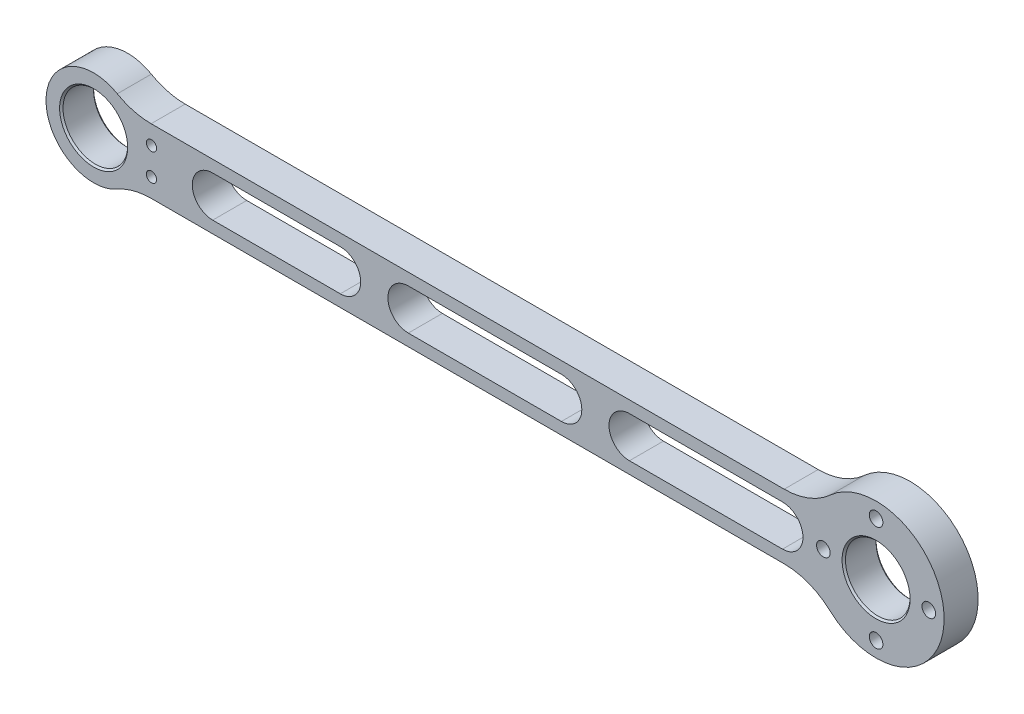
ISO-10303-21;
HEADER;
FILE_DESCRIPTION(('STEP AP214'),'2;1');
FILE_NAME('part.step','',(''),(''),'','','');
FILE_SCHEMA(('AUTOMOTIVE_DESIGN { 1 0 10303 214 1 1 1 1 }'));
ENDSEC;
DATA;
#1=APPLICATION_CONTEXT('core data for automotive mechanical design processes');
#2=APPLICATION_PROTOCOL_DEFINITION('international standard','automotive_design',2000,#1);
#3=PRODUCT_CONTEXT('',#1,'mechanical');
#4=PRODUCT('Part','Part','',(#3));
#5=PRODUCT_RELATED_PRODUCT_CATEGORY('part','',(#4));
#6=PRODUCT_DEFINITION_FORMATION('','',#4);
#7=PRODUCT_DEFINITION_CONTEXT('part definition',#1,'design');
#8=PRODUCT_DEFINITION('design','',#6,#7);
#9=PRODUCT_DEFINITION_SHAPE('','',#8);
#10=(LENGTH_UNIT() NAMED_UNIT(*) SI_UNIT(.MILLI.,.METRE.));
#11=(NAMED_UNIT(*) PLANE_ANGLE_UNIT() SI_UNIT($,.RADIAN.));
#12=(NAMED_UNIT(*) SI_UNIT($,.STERADIAN.) SOLID_ANGLE_UNIT());
#13=UNCERTAINTY_MEASURE_WITH_UNIT(LENGTH_MEASURE(1.E-05),#10,'distance_accuracy_value','');
#14=(GEOMETRIC_REPRESENTATION_CONTEXT(3) GLOBAL_UNCERTAINTY_ASSIGNED_CONTEXT((#13)) GLOBAL_UNIT_ASSIGNED_CONTEXT((#10,
#11,#12)) REPRESENTATION_CONTEXT('',''));
#15=CARTESIAN_POINT('',(0.,0.,0.));
#16=DIRECTION('',(0.,0.,1.));
#17=DIRECTION('',(1.,0.,0.));
#18=AXIS2_PLACEMENT_3D('',#15,#16,#17);
#19=CARTESIAN_POINT('',(202.986114681519,-29.5,10.));
#20=DIRECTION('',(0.,0.,-1.));
#21=DIRECTION('',(-1.,0.,0.));
#22=AXIS2_PLACEMENT_3D('',#19,#20,#21);
#23=CYLINDRICAL_SURFACE('',#22,20.);
#24=CARTESIAN_POINT('',(202.986114681519,-29.5,0.));
#25=DIRECTION('',(0.,0.,1.));
#26=DIRECTION('',(1.,0.,0.));
#27=AXIS2_PLACEMENT_3D('',#24,#25,#26);
#28=CIRCLE('',#27,20.);
#29=CARTESIAN_POINT('',(202.986114681519,-9.49999999999998,0.));
#30=VERTEX_POINT('',#29);
#31=CARTESIAN_POINT('',(216.49305734076,-14.7500000000001,0.));
#32=VERTEX_POINT('',#31);
#33=EDGE_CURVE('E274',#30,#32,#28,.F.);
#34=ORIENTED_EDGE('',*,*,#33,.T.);
#35=DIRECTION('',(0.,0.,-1.));
#36=VECTOR('',#35,1.);
#37=CARTESIAN_POINT('',(216.49305734076,-14.7500000000001,10.));
#38=LINE('',#37,#36);
#39=CARTESIAN_POINT('',(216.49305734076,-14.7500000000001,10.));
#40=VERTEX_POINT('',#39);
#41=EDGE_CURVE('E337',#40,#32,#38,.T.);
#42=ORIENTED_EDGE('',*,*,#41,.F.);
#43=CARTESIAN_POINT('',(202.986114681519,-29.5,10.));
#44=DIRECTION('',(0.,0.,1.));
#45=DIRECTION('',(1.,0.,0.));
#46=AXIS2_PLACEMENT_3D('',#43,#44,#45);
#47=CIRCLE('',#46,20.);
#48=CARTESIAN_POINT('',(202.986114681519,-9.49999999999998,10.));
#49=VERTEX_POINT('',#48);
#50=EDGE_CURVE('E281',#49,#40,#47,.F.);
#51=ORIENTED_EDGE('',*,*,#50,.F.);
#52=DIRECTION('',(0.,0.,-1.));
#53=VECTOR('',#52,1.);
#54=CARTESIAN_POINT('',(202.986114681519,-9.49999999999998,10.));
#55=LINE('',#54,#53);
#56=EDGE_CURVE('E301',#49,#30,#55,.T.);
#57=ORIENTED_EDGE('',*,*,#56,.T.);
#58=EDGE_LOOP('',(#34,#42,#51,#57));
#59=FACE_BOUND('',#58,.T.);
#60=ADVANCED_FACE('F38',(#59),#23,.F.);
#61=CARTESIAN_POINT('',(230.,0.,10.));
#62=DIRECTION('',(0.,0.,-1.));
#63=DIRECTION('',(-1.,0.,0.));
#64=AXIS2_PLACEMENT_3D('',#61,#62,#63);
#65=CYLINDRICAL_SURFACE('',#64,20.0000000000002);
#66=CARTESIAN_POINT('',(230.,0.,0.));
#67=DIRECTION('',(0.,0.,1.));
#68=DIRECTION('',(1.,0.,0.));
#69=AXIS2_PLACEMENT_3D('',#66,#67,#68);
#70=CIRCLE('',#69,20.0000000000002);
#71=CARTESIAN_POINT('',(216.49305734076,14.7500000000001,0.));
#72=VERTEX_POINT('',#71);
#73=EDGE_CURVE('E304',#32,#72,#70,.T.);
#74=ORIENTED_EDGE('',*,*,#73,.T.);
#75=DIRECTION('',(0.,0.,-1.));
#76=VECTOR('',#75,1.);
#77=CARTESIAN_POINT('',(216.49305734076,14.7500000000001,10.));
#78=LINE('',#77,#76);
#79=CARTESIAN_POINT('',(216.49305734076,14.7500000000001,10.));
#80=VERTEX_POINT('',#79);
#81=EDGE_CURVE('E334',#80,#72,#78,.T.);
#82=ORIENTED_EDGE('',*,*,#81,.F.);
#83=CARTESIAN_POINT('',(230.,0.,10.));
#84=DIRECTION('',(0.,0.,1.));
#85=DIRECTION('',(1.,0.,0.));
#86=AXIS2_PLACEMENT_3D('',#83,#84,#85);
#87=CIRCLE('',#86,20.0000000000002);
#88=EDGE_CURVE('E284',#40,#80,#87,.T.);
#89=ORIENTED_EDGE('',*,*,#88,.F.);
#90=ORIENTED_EDGE('',*,*,#41,.T.);
#91=EDGE_LOOP('',(#74,#82,#89,#90));
#92=FACE_BOUND('',#91,.T.);
#93=ADVANCED_FACE('F377',(#92),#65,.T.);
#94=CARTESIAN_POINT('',(202.98611468152,29.5,10.));
#95=DIRECTION('',(0.,0.,-1.));
#96=DIRECTION('',(-1.,0.,0.));
#97=AXIS2_PLACEMENT_3D('',#94,#95,#96);
#98=CYLINDRICAL_SURFACE('',#97,20.);
#99=CARTESIAN_POINT('',(202.98611468152,29.5,0.));
#100=DIRECTION('',(0.,0.,1.));
#101=DIRECTION('',(1.,0.,0.));
#102=AXIS2_PLACEMENT_3D('',#99,#100,#101);
#103=CIRCLE('',#102,20.);
#104=CARTESIAN_POINT('',(202.98611468152,9.50000000000002,0.));
#105=VERTEX_POINT('',#104);
#106=EDGE_CURVE('E306',#72,#105,#103,.F.);
#107=ORIENTED_EDGE('',*,*,#106,.T.);
#108=DIRECTION('',(0.,0.,-1.));
#109=VECTOR('',#108,1.);
#110=CARTESIAN_POINT('',(202.98611468152,9.50000000000002,10.));
#111=LINE('',#110,#109);
#112=CARTESIAN_POINT('',(202.98611468152,9.50000000000002,10.));
#113=VERTEX_POINT('',#112);
#114=EDGE_CURVE('E331',#113,#105,#111,.T.);
#115=ORIENTED_EDGE('',*,*,#114,.F.);
#116=CARTESIAN_POINT('',(202.98611468152,29.5,10.));
#117=DIRECTION('',(0.,0.,1.));
#118=DIRECTION('',(1.,0.,0.));
#119=AXIS2_PLACEMENT_3D('',#116,#117,#118);
#120=CIRCLE('',#119,20.);
#121=EDGE_CURVE('E287',#80,#113,#120,.F.);
#122=ORIENTED_EDGE('',*,*,#121,.F.);
#123=ORIENTED_EDGE('',*,*,#81,.T.);
#124=EDGE_LOOP('',(#107,#115,#122,#123));
#125=FACE_BOUND('',#124,.T.);
#126=ADVANCED_FACE('F383',(#125),#98,.F.);
#127=CARTESIAN_POINT('',(0.,9.49999999999999,10.));
#128=DIRECTION('',(0.,-1.,0.));
#129=DIRECTION('',(1.,0.,0.));
#130=AXIS2_PLACEMENT_3D('',#127,#128,#129);
#131=PLANE('',#130);
#132=DIRECTION('',(-1.,0.,0.));
#133=VECTOR('',#132,1.);
#134=CARTESIAN_POINT('',(0.,9.49999999999999,0.));
#135=LINE('',#134,#133);
#136=CARTESIAN_POINT('',(16.904141504377,9.49999999999999,0.));
#137=VERTEX_POINT('',#136);
#138=EDGE_CURVE('E308',#105,#137,#135,.T.);
#139=ORIENTED_EDGE('',*,*,#138,.T.);
#140=DIRECTION('',(0.,0.,-1.));
#141=VECTOR('',#140,1.);
#142=CARTESIAN_POINT('',(16.904141504377,9.49999999999999,10.));
#143=LINE('',#142,#141);
#144=CARTESIAN_POINT('',(16.904141504377,9.49999999999999,10.));
#145=VERTEX_POINT('',#144);
#146=EDGE_CURVE('E329',#145,#137,#143,.T.);
#147=ORIENTED_EDGE('',*,*,#146,.F.);
#148=DIRECTION('',(-1.,0.,0.));
#149=VECTOR('',#148,1.);
#150=CARTESIAN_POINT('',(0.,9.49999999999999,10.));
#151=LINE('',#150,#149);
#152=EDGE_CURVE('E289',#113,#145,#151,.T.);
#153=ORIENTED_EDGE('',*,*,#152,.F.);
#154=ORIENTED_EDGE('',*,*,#114,.T.);
#155=EDGE_LOOP('',(#139,#147,#153,#154));
#156=FACE_BOUND('',#155,.T.);
#157=ADVANCED_FACE('F436',(#156),#131,.F.);
#158=CARTESIAN_POINT('',(16.904141504377,29.5,10.));
#159=DIRECTION('',(0.,0.,-1.));
#160=DIRECTION('',(-1.,0.,0.));
#161=AXIS2_PLACEMENT_3D('',#158,#159,#160);
#162=CYLINDRICAL_SURFACE('',#161,20.);
#163=CARTESIAN_POINT('',(16.904141504377,29.5,0.));
#164=DIRECTION('',(0.,0.,1.));
#165=DIRECTION('',(1.,0.,0.));
#166=AXIS2_PLACEMENT_3D('',#163,#164,#165);
#167=CIRCLE('',#166,20.);
#168=CARTESIAN_POINT('',(6.96052885474347,12.1470588235294,0.));
#169=VERTEX_POINT('',#168);
#170=EDGE_CURVE('E311',#169,#137,#167,.T.);
#171=ORIENTED_EDGE('',*,*,#170,.F.);
#172=DIRECTION('',(0.,0.,-1.));
#173=VECTOR('',#172,1.);
#174=CARTESIAN_POINT('',(6.96052885474347,12.1470588235294,10.));
#175=LINE('',#174,#173);
#176=CARTESIAN_POINT('',(6.96052885474347,12.1470588235294,10.));
#177=VERTEX_POINT('',#176);
#178=EDGE_CURVE('E327',#177,#169,#175,.T.);
#179=ORIENTED_EDGE('',*,*,#178,.F.);
#180=CARTESIAN_POINT('',(16.904141504377,29.5,10.));
#181=DIRECTION('',(0.,0.,1.));
#182=DIRECTION('',(1.,0.,0.));
#183=AXIS2_PLACEMENT_3D('',#180,#181,#182);
#184=CIRCLE('',#183,20.);
#185=EDGE_CURVE('E291',#177,#145,#184,.T.);
#186=ORIENTED_EDGE('',*,*,#185,.T.);
#187=ORIENTED_EDGE('',*,*,#146,.T.);
#188=EDGE_LOOP('',(#171,#179,#186,#187));
#189=FACE_BOUND('',#188,.T.);
#190=ADVANCED_FACE('F430',(#189),#162,.F.);
#191=CARTESIAN_POINT('',(0.,0.,10.));
#192=DIRECTION('',(0.,0.,-1.));
#193=DIRECTION('',(-1.,0.,0.));
#194=AXIS2_PLACEMENT_3D('',#191,#192,#193);
#195=CYLINDRICAL_SURFACE('',#194,14.);
#196=CARTESIAN_POINT('',(0.,0.,0.));
#197=DIRECTION('',(0.,0.,1.));
#198=DIRECTION('',(1.,0.,0.));
#199=AXIS2_PLACEMENT_3D('',#196,#197,#198);
#200=CIRCLE('',#199,14.);
#201=CARTESIAN_POINT('',(6.96052885474345,-12.1470588235294,0.));
#202=VERTEX_POINT('',#201);
#203=EDGE_CURVE('E314',#169,#202,#200,.T.);
#204=ORIENTED_EDGE('',*,*,#203,.T.);
#205=DIRECTION('',(0.,0.,-1.));
#206=VECTOR('',#205,1.);
#207=CARTESIAN_POINT('',(6.96052885474345,-12.1470588235294,10.));
#208=LINE('',#207,#206);
#209=CARTESIAN_POINT('',(6.96052885474345,-12.1470588235294,10.));
#210=VERTEX_POINT('',#209);
#211=EDGE_CURVE('E324',#210,#202,#208,.T.);
#212=ORIENTED_EDGE('',*,*,#211,.F.);
#213=CARTESIAN_POINT('',(0.,0.,10.));
#214=DIRECTION('',(0.,0.,1.));
#215=DIRECTION('',(1.,0.,0.));
#216=AXIS2_PLACEMENT_3D('',#213,#214,#215);
#217=CIRCLE('',#216,14.);
#218=EDGE_CURVE('E294',#177,#210,#217,.T.);
#219=ORIENTED_EDGE('',*,*,#218,.F.);
#220=ORIENTED_EDGE('',*,*,#178,.T.);
#221=EDGE_LOOP('',(#204,#212,#219,#220));
#222=FACE_BOUND('',#221,.T.);
#223=ADVANCED_FACE('F442',(#222),#195,.T.);
#224=CARTESIAN_POINT('',(16.904141504377,-29.5,10.));
#225=DIRECTION('',(0.,0.,-1.));
#226=DIRECTION('',(-1.,0.,0.));
#227=AXIS2_PLACEMENT_3D('',#224,#225,#226);
#228=CYLINDRICAL_SURFACE('',#227,20.);
#229=CARTESIAN_POINT('',(16.904141504377,-29.5,0.));
#230=DIRECTION('',(0.,0.,1.));
#231=DIRECTION('',(1.,0.,0.));
#232=AXIS2_PLACEMENT_3D('',#229,#230,#231);
#233=CIRCLE('',#232,20.);
#234=CARTESIAN_POINT('',(16.904141504377,-9.50000000000001,0.));
#235=VERTEX_POINT('',#234);
#236=EDGE_CURVE('E316',#202,#235,#233,.F.);
#237=ORIENTED_EDGE('',*,*,#236,.T.);
#238=DIRECTION('',(0.,0.,-1.));
#239=VECTOR('',#238,1.);
#240=CARTESIAN_POINT('',(16.904141504377,-9.50000000000001,10.));
#241=LINE('',#240,#239);
#242=CARTESIAN_POINT('',(16.904141504377,-9.50000000000001,10.));
#243=VERTEX_POINT('',#242);
#244=EDGE_CURVE('E322',#243,#235,#241,.T.);
#245=ORIENTED_EDGE('',*,*,#244,.F.);
#246=CARTESIAN_POINT('',(16.904141504377,-29.5,10.));
#247=DIRECTION('',(0.,0.,1.));
#248=DIRECTION('',(1.,0.,0.));
#249=AXIS2_PLACEMENT_3D('',#246,#247,#248);
#250=CIRCLE('',#249,20.);
#251=EDGE_CURVE('E296',#210,#243,#250,.F.);
#252=ORIENTED_EDGE('',*,*,#251,.F.);
#253=ORIENTED_EDGE('',*,*,#211,.T.);
#254=EDGE_LOOP('',(#237,#245,#252,#253));
#255=FACE_BOUND('',#254,.T.);
#256=ADVANCED_FACE('F423',(#255),#228,.F.);
#257=CARTESIAN_POINT('',(0.,0.,10.));
#258=DIRECTION('',(0.,0.,-1.));
#259=DIRECTION('',(-1.,0.,0.));
#260=AXIS2_PLACEMENT_3D('',#257,#258,#259);
#261=CYLINDRICAL_SURFACE('',#260,9.5);
#262=CARTESIAN_POINT('',(0.,0.,9.50000000000004));
#263=DIRECTION('',(0.,0.,1.));
#264=DIRECTION('',(1.,0.,0.));
#265=AXIS2_PLACEMENT_3D('',#262,#263,#264);
#266=CIRCLE('',#265,9.5);
#267=CARTESIAN_POINT('',(9.5,0.,9.50000000000004));
#268=VERTEX_POINT('',#267);
#269=EDGE_CURVE('E343',#268,#268,#266,.T.);
#270=ORIENTED_EDGE('',*,*,#269,.T.);
#271=EDGE_LOOP('',(#270));
#272=FACE_BOUND('',#271,.T.);
#273=CARTESIAN_POINT('',(0.,0.,0.499999999999974));
#274=DIRECTION('',(0.,0.,1.));
#275=DIRECTION('',(1.,0.,0.));
#276=AXIS2_PLACEMENT_3D('',#273,#274,#275);
#277=CIRCLE('',#276,9.5);
#278=CARTESIAN_POINT('',(9.5,0.,0.499999999999974));
#279=VERTEX_POINT('',#278);
#280=EDGE_CURVE('E340',#279,#279,#277,.F.);
#281=ORIENTED_EDGE('',*,*,#280,.T.);
#282=EDGE_LOOP('',(#281));
#283=FACE_BOUND('',#282,.T.);
#284=ADVANCED_FACE('F449',(#272,#283),#261,.F.);
#285=CARTESIAN_POINT('',(0.,-9.50000000000001,10.));
#286=DIRECTION('',(0.,-1.,0.));
#287=DIRECTION('',(0.,0.,-1.));
#288=AXIS2_PLACEMENT_3D('',#285,#286,#287);
#289=PLANE('',#288);
#290=DIRECTION('',(-1.,0.,0.));
#291=VECTOR('',#290,1.);
#292=CARTESIAN_POINT('',(0.,-9.50000000000001,0.));
#293=LINE('',#292,#291);
#294=EDGE_CURVE('E285',#30,#235,#293,.T.);
#295=ORIENTED_EDGE('',*,*,#294,.F.);
#296=ORIENTED_EDGE('',*,*,#56,.F.);
#297=DIRECTION('',(-1.,0.,0.));
#298=VECTOR('',#297,1.);
#299=CARTESIAN_POINT('',(0.,-9.50000000000001,10.));
#300=LINE('',#299,#298);
#301=EDGE_CURVE('E298',#49,#243,#300,.T.);
#302=ORIENTED_EDGE('',*,*,#301,.T.);
#303=ORIENTED_EDGE('',*,*,#244,.T.);
#304=EDGE_LOOP('',(#295,#296,#302,#303));
#305=FACE_BOUND('',#304,.T.);
#306=ADVANCED_FACE('F417',(#305),#289,.T.);
#307=CARTESIAN_POINT('',(230.,0.,10.));
#308=DIRECTION('',(0.,0.,-1.));
#309=DIRECTION('',(-1.,0.,0.));
#310=AXIS2_PLACEMENT_3D('',#307,#308,#309);
#311=CYLINDRICAL_SURFACE('',#310,9.50000000000001);
#312=CARTESIAN_POINT('',(230.,0.,0.500000000000006));
#313=DIRECTION('',(0.,0.,1.));
#314=DIRECTION('',(1.,0.,0.));
#315=AXIS2_PLACEMENT_3D('',#312,#313,#314);
#316=CIRCLE('',#315,9.50000000000001);
#317=CARTESIAN_POINT('',(239.5,0.,0.500000000000006));
#318=VERTEX_POINT('',#317);
#319=EDGE_CURVE('E11',#318,#318,#316,.F.);
#320=ORIENTED_EDGE('',*,*,#319,.T.);
#321=EDGE_LOOP('',(#320));
#322=FACE_BOUND('',#321,.T.);
#323=CARTESIAN_POINT('',(230.,0.,9.50000000000005));
#324=DIRECTION('',(0.,0.,1.));
#325=DIRECTION('',(1.,0.,0.));
#326=AXIS2_PLACEMENT_3D('',#323,#324,#325);
#327=CIRCLE('',#326,9.50000000000001);
#328=CARTESIAN_POINT('',(239.5,0.,9.50000000000005));
#329=VERTEX_POINT('',#328);
#330=EDGE_CURVE('E352',#329,#329,#327,.T.);
#331=ORIENTED_EDGE('',*,*,#330,.T.);
#332=EDGE_LOOP('',(#331));
#333=FACE_BOUND('',#332,.T.);
#334=ADVANCED_FACE('F490',(#322,#333),#311,.F.);
#335=CARTESIAN_POINT('',(0.,0.,10.));
#336=DIRECTION('',(0.,0.,1.));
#337=DIRECTION('',(1.,0.,0.));
#338=AXIS2_PLACEMENT_3D('',#335,#336,#337);
#339=PLANE('',#338);
#340=CARTESIAN_POINT('',(17.,4.,10.));
#341=DIRECTION('',(0.,0.,1.));
#342=DIRECTION('',(1.,0.,0.));
#343=AXIS2_PLACEMENT_3D('',#340,#341,#342);
#344=CIRCLE('',#343,1.5);
#345=CARTESIAN_POINT('',(18.5,4.,10.));
#346=VERTEX_POINT('',#345);
#347=EDGE_CURVE('E721',#346,#346,#344,.T.);
#348=ORIENTED_EDGE('',*,*,#347,.F.);
#349=EDGE_LOOP('',(#348));
#350=FACE_BOUND('',#349,.T.);
#351=CARTESIAN_POINT('',(17.,-4.,10.));
#352=DIRECTION('',(0.,0.,1.));
#353=DIRECTION('',(1.,0.,0.));
#354=AXIS2_PLACEMENT_3D('',#351,#352,#353);
#355=CIRCLE('',#354,1.5);
#356=CARTESIAN_POINT('',(18.5,-4.,10.));
#357=VERTEX_POINT('',#356);
#358=EDGE_CURVE('E727',#357,#357,#355,.T.);
#359=ORIENTED_EDGE('',*,*,#358,.F.);
#360=EDGE_LOOP('',(#359));
#361=FACE_BOUND('',#360,.T.);
#362=CARTESIAN_POINT('',(230.,15.5,10.));
#363=DIRECTION('',(0.,0.,1.));
#364=DIRECTION('',(0.,-1.,0.));
#365=AXIS2_PLACEMENT_3D('',#362,#363,#364);
#366=CIRCLE('',#365,2.);
#367=CARTESIAN_POINT('',(230.,13.5,10.));
#368=VERTEX_POINT('',#367);
#369=EDGE_CURVE('E735',#368,#368,#366,.T.);
#370=ORIENTED_EDGE('',*,*,#369,.F.);
#371=EDGE_LOOP('',(#370));
#372=FACE_BOUND('',#371,.T.);
#373=CARTESIAN_POINT('',(245.5,1.08235921504137E-13,10.));
#374=DIRECTION('',(0.,0.,1.));
#375=DIRECTION('',(-1.,0.,0.));
#376=AXIS2_PLACEMENT_3D('',#373,#374,#375);
#377=CIRCLE('',#376,2.);
#378=CARTESIAN_POINT('',(243.5,1.08235921504137E-13,10.));
#379=VERTEX_POINT('',#378);
#380=EDGE_CURVE('E741',#379,#379,#377,.T.);
#381=ORIENTED_EDGE('',*,*,#380,.F.);
#382=EDGE_LOOP('',(#381));
#383=FACE_BOUND('',#382,.T.);
#384=CARTESIAN_POINT('',(230.,-15.5,10.));
#385=DIRECTION('',(0.,0.,1.));
#386=DIRECTION('',(0.,1.,0.));
#387=AXIS2_PLACEMENT_3D('',#384,#385,#386);
#388=CIRCLE('',#387,2.);
#389=CARTESIAN_POINT('',(230.,-13.5,10.));
#390=VERTEX_POINT('',#389);
#391=EDGE_CURVE('E724',#390,#390,#388,.T.);
#392=ORIENTED_EDGE('',*,*,#391,.F.);
#393=EDGE_LOOP('',(#392));
#394=FACE_BOUND('',#393,.T.);
#395=CARTESIAN_POINT('',(214.5,-1.08235921504137E-13,10.));
#396=DIRECTION('',(0.,0.,1.));
#397=DIRECTION('',(1.,0.,0.));
#398=AXIS2_PLACEMENT_3D('',#395,#396,#397);
#399=CIRCLE('',#398,2.);
#400=CARTESIAN_POINT('',(216.5,-1.08235921504137E-13,10.));
#401=VERTEX_POINT('',#400);
#402=EDGE_CURVE('E202',#401,#401,#399,.T.);
#403=ORIENTED_EDGE('',*,*,#402,.F.);
#404=EDGE_LOOP('',(#403));
#405=FACE_BOUND('',#404,.T.);
#406=CARTESIAN_POINT('',(230.,0.,10.));
#407=DIRECTION('',(0.,0.,1.));
#408=DIRECTION('',(1.,0.,0.));
#409=AXIS2_PLACEMENT_3D('',#406,#407,#408);
#410=CIRCLE('',#409,9.99999999999998);
#411=CARTESIAN_POINT('',(240.,0.,10.));
#412=VERTEX_POINT('',#411);
#413=EDGE_CURVE('E355',#412,#412,#410,.F.);
#414=ORIENTED_EDGE('',*,*,#413,.T.);
#415=EDGE_LOOP('',(#414));
#416=FACE_BOUND('',#415,.T.);
#417=CARTESIAN_POINT('',(72.5,0.,10.));
#418=DIRECTION('',(0.,0.,1.));
#419=DIRECTION('',(1.,0.,0.));
#420=AXIS2_PLACEMENT_3D('',#417,#418,#419);
#421=CIRCLE('',#420,6.);
#422=CARTESIAN_POINT('',(72.5,-6.,10.));
#423=VERTEX_POINT('',#422);
#424=CARTESIAN_POINT('',(72.5,6.,10.));
#425=VERTEX_POINT('',#424);
#426=EDGE_CURVE('E53',#423,#425,#421,.T.);
#427=ORIENTED_EDGE('',*,*,#426,.F.);
#428=DIRECTION('',(1.,0.,0.));
#429=VECTOR('',#428,1.);
#430=CARTESIAN_POINT('',(35.,-6.,10.));
#431=LINE('',#430,#429);
#432=CARTESIAN_POINT('',(35.,-6.,10.));
#433=VERTEX_POINT('',#432);
#434=EDGE_CURVE('E223',#433,#423,#431,.T.);
#435=ORIENTED_EDGE('',*,*,#434,.F.);
#436=CARTESIAN_POINT('',(35.,0.,10.));
#437=DIRECTION('',(0.,0.,1.));
#438=DIRECTION('',(1.,0.,0.));
#439=AXIS2_PLACEMENT_3D('',#436,#437,#438);
#440=CIRCLE('',#439,6.);
#441=CARTESIAN_POINT('',(35.,6.,10.));
#442=VERTEX_POINT('',#441);
#443=EDGE_CURVE('E238',#442,#433,#440,.T.);
#444=ORIENTED_EDGE('',*,*,#443,.F.);
#445=DIRECTION('',(-1.,0.,0.));
#446=VECTOR('',#445,1.);
#447=CARTESIAN_POINT('',(35.,6.,10.));
#448=LINE('',#447,#446);
#449=EDGE_CURVE('E234',#425,#442,#448,.T.);
#450=ORIENTED_EDGE('',*,*,#449,.F.);
#451=EDGE_LOOP('',(#427,#435,#444,#450));
#452=FACE_BOUND('',#451,.T.);
#453=CARTESIAN_POINT('',(202.5,0.,10.));
#454=DIRECTION('',(0.,0.,1.));
#455=DIRECTION('',(1.,0.,0.));
#456=AXIS2_PLACEMENT_3D('',#453,#454,#455);
#457=CIRCLE('',#456,6.);
#458=CARTESIAN_POINT('',(202.5,-6.,10.));
#459=VERTEX_POINT('',#458);
#460=CARTESIAN_POINT('',(202.5,6.,10.));
#461=VERTEX_POINT('',#460);
#462=EDGE_CURVE('E61',#459,#461,#457,.T.);
#463=ORIENTED_EDGE('',*,*,#462,.F.);
#464=DIRECTION('',(1.,0.,0.));
#465=VECTOR('',#464,1.);
#466=CARTESIAN_POINT('',(157.5,-6.,10.));
#467=LINE('',#466,#465);
#468=CARTESIAN_POINT('',(157.5,-5.99999999999999,10.));
#469=VERTEX_POINT('',#468);
#470=EDGE_CURVE('E196',#469,#459,#467,.T.);
#471=ORIENTED_EDGE('',*,*,#470,.F.);
#472=CARTESIAN_POINT('',(157.5,0.,10.));
#473=DIRECTION('',(0.,0.,1.));
#474=DIRECTION('',(1.,0.,0.));
#475=AXIS2_PLACEMENT_3D('',#472,#473,#474);
#476=CIRCLE('',#475,6.);
#477=CARTESIAN_POINT('',(157.5,6.,10.));
#478=VERTEX_POINT('',#477);
#479=EDGE_CURVE('E199',#478,#469,#476,.T.);
#480=ORIENTED_EDGE('',*,*,#479,.F.);
#481=DIRECTION('',(-1.,0.,0.));
#482=VECTOR('',#481,1.);
#483=CARTESIAN_POINT('',(157.5,6.,10.));
#484=LINE('',#483,#482);
#485=EDGE_CURVE('E208',#461,#478,#484,.T.);
#486=ORIENTED_EDGE('',*,*,#485,.F.);
#487=EDGE_LOOP('',(#463,#471,#480,#486));
#488=FACE_BOUND('',#487,.T.);
#489=CARTESIAN_POINT('',(137.5,0.,10.));
#490=DIRECTION('',(0.,0.,1.));
#491=DIRECTION('',(1.,0.,0.));
#492=AXIS2_PLACEMENT_3D('',#489,#490,#491);
#493=CIRCLE('',#492,6.);
#494=CARTESIAN_POINT('',(137.5,-6.,10.));
#495=VERTEX_POINT('',#494);
#496=CARTESIAN_POINT('',(137.5,6.,10.));
#497=VERTEX_POINT('',#496);
#498=EDGE_CURVE('E215',#495,#497,#493,.T.);
#499=ORIENTED_EDGE('',*,*,#498,.F.);
#500=DIRECTION('',(1.,0.,0.));
#501=VECTOR('',#500,1.);
#502=CARTESIAN_POINT('',(92.5,-6.,10.));
#503=LINE('',#502,#501);
#504=CARTESIAN_POINT('',(92.5,-6.,10.));
#505=VERTEX_POINT('',#504);
#506=EDGE_CURVE('E253',#505,#495,#503,.T.);
#507=ORIENTED_EDGE('',*,*,#506,.F.);
#508=CARTESIAN_POINT('',(92.5,0.,10.));
#509=DIRECTION('',(0.,0.,1.));
#510=DIRECTION('',(1.,0.,0.));
#511=AXIS2_PLACEMENT_3D('',#508,#509,#510);
#512=CIRCLE('',#511,6.);
#513=CARTESIAN_POINT('',(92.5,6.,10.));
#514=VERTEX_POINT('',#513);
#515=EDGE_CURVE('E267',#514,#505,#512,.T.);
#516=ORIENTED_EDGE('',*,*,#515,.F.);
#517=DIRECTION('',(-1.,0.,0.));
#518=VECTOR('',#517,1.);
#519=CARTESIAN_POINT('',(92.5,6.,10.));
#520=LINE('',#519,#518);
#521=EDGE_CURVE('E264',#497,#514,#520,.T.);
#522=ORIENTED_EDGE('',*,*,#521,.F.);
#523=EDGE_LOOP('',(#499,#507,#516,#522));
#524=FACE_BOUND('',#523,.T.);
#525=CARTESIAN_POINT('',(0.,0.,10.));
#526=DIRECTION('',(0.,0.,1.));
#527=DIRECTION('',(1.,0.,0.));
#528=AXIS2_PLACEMENT_3D('',#525,#526,#527);
#529=CIRCLE('',#528,9.99999999999998);
#530=CARTESIAN_POINT('',(9.99999999999998,0.,10.));
#531=VERTEX_POINT('',#530);
#532=EDGE_CURVE('E346',#531,#531,#529,.F.);
#533=ORIENTED_EDGE('',*,*,#532,.T.);
#534=EDGE_LOOP('',(#533));
#535=FACE_BOUND('',#534,.T.);
#536=ORIENTED_EDGE('',*,*,#50,.T.);
#537=ORIENTED_EDGE('',*,*,#88,.T.);
#538=ORIENTED_EDGE('',*,*,#121,.T.);
#539=ORIENTED_EDGE('',*,*,#152,.T.);
#540=ORIENTED_EDGE('',*,*,#185,.F.);
#541=ORIENTED_EDGE('',*,*,#218,.T.);
#542=ORIENTED_EDGE('',*,*,#251,.T.);
#543=ORIENTED_EDGE('',*,*,#301,.F.);
#544=EDGE_LOOP('',(#536,#537,#538,#539,#540,#541,#542,#543));
#545=FACE_BOUND('',#544,.T.);
#546=ADVANCED_FACE('F408',(#350,#361,#372,#383,#394,#405,#416,#452,#488,#524,#535,#545),#339,.T.);
#547=CARTESIAN_POINT('',(0.,0.,0.));
#548=DIRECTION('',(0.,0.,1.));
#549=DIRECTION('',(1.,0.,0.));
#550=AXIS2_PLACEMENT_3D('',#547,#548,#549);
#551=PLANE('',#550);
#552=CARTESIAN_POINT('',(17.,4.,0.));
#553=DIRECTION('',(0.,0.,1.));
#554=DIRECTION('',(1.,0.,0.));
#555=AXIS2_PLACEMENT_3D('',#552,#553,#554);
#556=CIRCLE('',#555,1.5);
#557=CARTESIAN_POINT('',(18.5,4.,0.));
#558=VERTEX_POINT('',#557);
#559=EDGE_CURVE('E718',#558,#558,#556,.T.);
#560=ORIENTED_EDGE('',*,*,#559,.T.);
#561=EDGE_LOOP('',(#560));
#562=FACE_BOUND('',#561,.T.);
#563=CARTESIAN_POINT('',(17.,-4.,0.));
#564=DIRECTION('',(0.,0.,1.));
#565=DIRECTION('',(1.,0.,0.));
#566=AXIS2_PLACEMENT_3D('',#563,#564,#565);
#567=CIRCLE('',#566,1.5);
#568=CARTESIAN_POINT('',(18.5,-4.,0.));
#569=VERTEX_POINT('',#568);
#570=EDGE_CURVE('E722',#569,#569,#567,.T.);
#571=ORIENTED_EDGE('',*,*,#570,.T.);
#572=EDGE_LOOP('',(#571));
#573=FACE_BOUND('',#572,.T.);
#574=CARTESIAN_POINT('',(230.,15.5,0.));
#575=DIRECTION('',(0.,0.,1.));
#576=DIRECTION('',(0.,-1.,0.));
#577=AXIS2_PLACEMENT_3D('',#574,#575,#576);
#578=CIRCLE('',#577,2.);
#579=CARTESIAN_POINT('',(230.,13.5,0.));
#580=VERTEX_POINT('',#579);
#581=EDGE_CURVE('E732',#580,#580,#578,.T.);
#582=ORIENTED_EDGE('',*,*,#581,.T.);
#583=EDGE_LOOP('',(#582));
#584=FACE_BOUND('',#583,.T.);
#585=CARTESIAN_POINT('',(245.5,1.08235921504137E-13,0.));
#586=DIRECTION('',(0.,0.,1.));
#587=DIRECTION('',(-1.,0.,0.));
#588=AXIS2_PLACEMENT_3D('',#585,#586,#587);
#589=CIRCLE('',#588,2.);
#590=CARTESIAN_POINT('',(243.5,1.08235921504137E-13,0.));
#591=VERTEX_POINT('',#590);
#592=EDGE_CURVE('E738',#591,#591,#589,.T.);
#593=ORIENTED_EDGE('',*,*,#592,.T.);
#594=EDGE_LOOP('',(#593));
#595=FACE_BOUND('',#594,.T.);
#596=CARTESIAN_POINT('',(230.,-15.5,0.));
#597=DIRECTION('',(0.,0.,1.));
#598=DIRECTION('',(0.,1.,0.));
#599=AXIS2_PLACEMENT_3D('',#596,#597,#598);
#600=CIRCLE('',#599,2.);
#601=CARTESIAN_POINT('',(230.,-13.5,0.));
#602=VERTEX_POINT('',#601);
#603=EDGE_CURVE('E744',#602,#602,#600,.T.);
#604=ORIENTED_EDGE('',*,*,#603,.T.);
#605=EDGE_LOOP('',(#604));
#606=FACE_BOUND('',#605,.T.);
#607=CARTESIAN_POINT('',(214.5,-1.08235921504137E-13,0.));
#608=DIRECTION('',(0.,0.,1.));
#609=DIRECTION('',(1.,0.,0.));
#610=AXIS2_PLACEMENT_3D('',#607,#608,#609);
#611=CIRCLE('',#610,2.);
#612=CARTESIAN_POINT('',(216.5,-1.08235921504137E-13,0.));
#613=VERTEX_POINT('',#612);
#614=EDGE_CURVE('E235',#613,#613,#611,.T.);
#615=ORIENTED_EDGE('',*,*,#614,.T.);
#616=EDGE_LOOP('',(#615));
#617=FACE_BOUND('',#616,.T.);
#618=CARTESIAN_POINT('',(230.,0.,0.));
#619=DIRECTION('',(0.,0.,1.));
#620=DIRECTION('',(1.,0.,0.));
#621=AXIS2_PLACEMENT_3D('',#618,#619,#620);
#622=CIRCLE('',#621,10.);
#623=CARTESIAN_POINT('',(240.,0.,0.));
#624=VERTEX_POINT('',#623);
#625=EDGE_CURVE('E46',#624,#624,#622,.T.);
#626=ORIENTED_EDGE('',*,*,#625,.T.);
#627=EDGE_LOOP('',(#626));
#628=FACE_BOUND('',#627,.T.);
#629=DIRECTION('',(1.,0.,0.));
#630=VECTOR('',#629,1.);
#631=CARTESIAN_POINT('',(35.,-6.,0.));
#632=LINE('',#631,#630);
#633=CARTESIAN_POINT('',(35.,-6.,0.));
#634=VERTEX_POINT('',#633);
#635=CARTESIAN_POINT('',(72.5,-6.,0.));
#636=VERTEX_POINT('',#635);
#637=EDGE_CURVE('E229',#634,#636,#632,.T.);
#638=ORIENTED_EDGE('',*,*,#637,.T.);
#639=CARTESIAN_POINT('',(72.5,0.,0.));
#640=DIRECTION('',(0.,0.,1.));
#641=DIRECTION('',(1.,0.,0.));
#642=AXIS2_PLACEMENT_3D('',#639,#640,#641);
#643=CIRCLE('',#642,6.);
#644=CARTESIAN_POINT('',(72.5,6.,0.));
#645=VERTEX_POINT('',#644);
#646=EDGE_CURVE('E219',#636,#645,#643,.T.);
#647=ORIENTED_EDGE('',*,*,#646,.T.);
#648=DIRECTION('',(-1.,0.,0.));
#649=VECTOR('',#648,1.);
#650=CARTESIAN_POINT('',(35.,6.,0.));
#651=LINE('',#650,#649);
#652=CARTESIAN_POINT('',(35.,6.,0.));
#653=VERTEX_POINT('',#652);
#654=EDGE_CURVE('E222',#645,#653,#651,.T.);
#655=ORIENTED_EDGE('',*,*,#654,.T.);
#656=CARTESIAN_POINT('',(35.,0.,0.));
#657=DIRECTION('',(0.,0.,1.));
#658=DIRECTION('',(1.,0.,0.));
#659=AXIS2_PLACEMENT_3D('',#656,#657,#658);
#660=CIRCLE('',#659,6.);
#661=EDGE_CURVE('E226',#653,#634,#660,.T.);
#662=ORIENTED_EDGE('',*,*,#661,.T.);
#663=EDGE_LOOP('',(#638,#647,#655,#662));
#664=FACE_BOUND('',#663,.T.);
#665=DIRECTION('',(1.,0.,0.));
#666=VECTOR('',#665,1.);
#667=CARTESIAN_POINT('',(157.5,-6.,0.));
#668=LINE('',#667,#666);
#669=CARTESIAN_POINT('',(157.5,-5.99999999999999,0.));
#670=VERTEX_POINT('',#669);
#671=CARTESIAN_POINT('',(202.5,-6.,0.));
#672=VERTEX_POINT('',#671);
#673=EDGE_CURVE('E183',#670,#672,#668,.T.);
#674=ORIENTED_EDGE('',*,*,#673,.T.);
#675=CARTESIAN_POINT('',(202.5,0.,0.));
#676=DIRECTION('',(0.,0.,1.));
#677=DIRECTION('',(1.,0.,0.));
#678=AXIS2_PLACEMENT_3D('',#675,#676,#677);
#679=CIRCLE('',#678,6.);
#680=CARTESIAN_POINT('',(202.5,6.,0.));
#681=VERTEX_POINT('',#680);
#682=EDGE_CURVE('E177',#672,#681,#679,.T.);
#683=ORIENTED_EDGE('',*,*,#682,.T.);
#684=DIRECTION('',(-1.,0.,0.));
#685=VECTOR('',#684,1.);
#686=CARTESIAN_POINT('',(157.5,6.,0.));
#687=LINE('',#686,#685);
#688=CARTESIAN_POINT('',(157.5,6.,0.));
#689=VERTEX_POINT('',#688);
#690=EDGE_CURVE('E187',#681,#689,#687,.T.);
#691=ORIENTED_EDGE('',*,*,#690,.T.);
#692=CARTESIAN_POINT('',(157.5,0.,0.));
#693=DIRECTION('',(0.,0.,1.));
#694=DIRECTION('',(1.,0.,0.));
#695=AXIS2_PLACEMENT_3D('',#692,#693,#694);
#696=CIRCLE('',#695,6.);
#697=EDGE_CURVE('E191',#689,#670,#696,.T.);
#698=ORIENTED_EDGE('',*,*,#697,.T.);
#699=EDGE_LOOP('',(#674,#683,#691,#698));
#700=FACE_BOUND('',#699,.T.);
#701=DIRECTION('',(1.,0.,0.));
#702=VECTOR('',#701,1.);
#703=CARTESIAN_POINT('',(92.5,-6.,0.));
#704=LINE('',#703,#702);
#705=CARTESIAN_POINT('',(92.5,-6.,0.));
#706=VERTEX_POINT('',#705);
#707=CARTESIAN_POINT('',(137.5,-6.,0.));
#708=VERTEX_POINT('',#707);
#709=EDGE_CURVE('E259',#706,#708,#704,.T.);
#710=ORIENTED_EDGE('',*,*,#709,.T.);
#711=CARTESIAN_POINT('',(137.5,0.,0.));
#712=DIRECTION('',(0.,0.,1.));
#713=DIRECTION('',(1.,0.,0.));
#714=AXIS2_PLACEMENT_3D('',#711,#712,#713);
#715=CIRCLE('',#714,6.);
#716=CARTESIAN_POINT('',(137.5,6.,0.));
#717=VERTEX_POINT('',#716);
#718=EDGE_CURVE('E249',#708,#717,#715,.T.);
#719=ORIENTED_EDGE('',*,*,#718,.T.);
#720=DIRECTION('',(-1.,0.,0.));
#721=VECTOR('',#720,1.);
#722=CARTESIAN_POINT('',(92.5,6.,0.));
#723=LINE('',#722,#721);
#724=CARTESIAN_POINT('',(92.5,6.,0.));
#725=VERTEX_POINT('',#724);
#726=EDGE_CURVE('E252',#717,#725,#723,.T.);
#727=ORIENTED_EDGE('',*,*,#726,.T.);
#728=CARTESIAN_POINT('',(92.5,0.,0.));
#729=DIRECTION('',(0.,0.,1.));
#730=DIRECTION('',(1.,0.,0.));
#731=AXIS2_PLACEMENT_3D('',#728,#729,#730);
#732=CIRCLE('',#731,6.);
#733=EDGE_CURVE('E256',#725,#706,#732,.T.);
#734=ORIENTED_EDGE('',*,*,#733,.T.);
#735=EDGE_LOOP('',(#710,#719,#727,#734));
#736=FACE_BOUND('',#735,.T.);
#737=CARTESIAN_POINT('',(0.,0.,0.));
#738=DIRECTION('',(0.,0.,1.));
#739=DIRECTION('',(1.,0.,0.));
#740=AXIS2_PLACEMENT_3D('',#737,#738,#739);
#741=CIRCLE('',#740,9.99999999999998);
#742=CARTESIAN_POINT('',(9.99999999999998,0.,0.));
#743=VERTEX_POINT('',#742);
#744=EDGE_CURVE('E349',#743,#743,#741,.T.);
#745=ORIENTED_EDGE('',*,*,#744,.T.);
#746=EDGE_LOOP('',(#745));
#747=FACE_BOUND('',#746,.T.);
#748=ORIENTED_EDGE('',*,*,#33,.F.);
#749=ORIENTED_EDGE('',*,*,#294,.T.);
#750=ORIENTED_EDGE('',*,*,#236,.F.);
#751=ORIENTED_EDGE('',*,*,#203,.F.);
#752=ORIENTED_EDGE('',*,*,#170,.T.);
#753=ORIENTED_EDGE('',*,*,#138,.F.);
#754=ORIENTED_EDGE('',*,*,#106,.F.);
#755=ORIENTED_EDGE('',*,*,#73,.F.);
#756=EDGE_LOOP('',(#748,#749,#750,#751,#752,#753,#754,#755));
#757=FACE_BOUND('',#756,.T.);
#758=ADVANCED_FACE('F193',(#562,#573,#584,#595,#606,#617,#628,#664,#700,#736,#747,#757),#551,.F.);
#759=CARTESIAN_POINT('',(0.,0.,9.50000000000004));
#760=DIRECTION('',(0.,0.,1.));
#761=DIRECTION('',(1.,0.,0.));
#762=AXIS2_PLACEMENT_3D('',#759,#760,#761);
#763=CONICAL_SURFACE('',#762,9.5,0.785398163397471);
#764=ORIENTED_EDGE('',*,*,#532,.F.);
#765=EDGE_LOOP('',(#764));
#766=FACE_BOUND('',#765,.T.);
#767=ORIENTED_EDGE('',*,*,#269,.F.);
#768=EDGE_LOOP('',(#767));
#769=FACE_BOUND('',#768,.T.);
#770=ADVANCED_FACE('F388',(#766,#769),#763,.F.);
#771=CARTESIAN_POINT('',(0.,0.,0.));
#772=DIRECTION('',(0.,0.,-1.));
#773=DIRECTION('',(-1.,0.,0.));
#774=AXIS2_PLACEMENT_3D('',#771,#772,#773);
#775=CONICAL_SURFACE('',#774,9.99999999999998,0.785398163397453);
#776=ORIENTED_EDGE('',*,*,#280,.F.);
#777=EDGE_LOOP('',(#776));
#778=FACE_BOUND('',#777,.T.);
#779=ORIENTED_EDGE('',*,*,#744,.F.);
#780=EDGE_LOOP('',(#779));
#781=FACE_BOUND('',#780,.T.);
#782=ADVANCED_FACE('F391',(#778,#781),#775,.F.);
#783=CARTESIAN_POINT('',(137.5,0.,0.));
#784=DIRECTION('',(0.,0.,1.));
#785=DIRECTION('',(1.,0.,0.));
#786=AXIS2_PLACEMENT_3D('',#783,#784,#785);
#787=CYLINDRICAL_SURFACE('',#786,6.);
#788=ORIENTED_EDGE('',*,*,#498,.T.);
#789=DIRECTION('',(0.,0.,1.));
#790=VECTOR('',#789,1.);
#791=CARTESIAN_POINT('',(137.5,6.,0.));
#792=LINE('',#791,#790);
#793=EDGE_CURVE('E262',#717,#497,#792,.T.);
#794=ORIENTED_EDGE('',*,*,#793,.F.);
#795=ORIENTED_EDGE('',*,*,#718,.F.);
#796=DIRECTION('',(0.,0.,1.));
#797=VECTOR('',#796,1.);
#798=CARTESIAN_POINT('',(137.5,-6.,0.));
#799=LINE('',#798,#797);
#800=EDGE_CURVE('E272',#708,#495,#799,.T.);
#801=ORIENTED_EDGE('',*,*,#800,.T.);
#802=EDGE_LOOP('',(#788,#794,#795,#801));
#803=FACE_BOUND('',#802,.T.);
#804=ADVANCED_FACE('F394',(#803),#787,.F.);
#805=CARTESIAN_POINT('',(92.5,-6.,0.));
#806=DIRECTION('',(0.,-1.,0.));
#807=DIRECTION('',(0.,0.,-1.));
#808=AXIS2_PLACEMENT_3D('',#805,#806,#807);
#809=PLANE('',#808);
#810=ORIENTED_EDGE('',*,*,#506,.T.);
#811=ORIENTED_EDGE('',*,*,#800,.F.);
#812=ORIENTED_EDGE('',*,*,#709,.F.);
#813=DIRECTION('',(0.,0.,1.));
#814=VECTOR('',#813,1.);
#815=CARTESIAN_POINT('',(92.5,-6.,0.));
#816=LINE('',#815,#814);
#817=EDGE_CURVE('E275',#706,#505,#816,.T.);
#818=ORIENTED_EDGE('',*,*,#817,.T.);
#819=EDGE_LOOP('',(#810,#811,#812,#818));
#820=FACE_BOUND('',#819,.T.);
#821=ADVANCED_FACE('F399',(#820),#809,.F.);
#822=CARTESIAN_POINT('',(92.5,0.,0.));
#823=DIRECTION('',(0.,0.,1.));
#824=DIRECTION('',(1.,0.,0.));
#825=AXIS2_PLACEMENT_3D('',#822,#823,#824);
#826=CYLINDRICAL_SURFACE('',#825,6.);
#827=ORIENTED_EDGE('',*,*,#515,.T.);
#828=ORIENTED_EDGE('',*,*,#817,.F.);
#829=ORIENTED_EDGE('',*,*,#733,.F.);
#830=DIRECTION('',(0.,0.,1.));
#831=VECTOR('',#830,1.);
#832=CARTESIAN_POINT('',(92.5,6.,0.));
#833=LINE('',#832,#831);
#834=EDGE_CURVE('E277',#725,#514,#833,.T.);
#835=ORIENTED_EDGE('',*,*,#834,.T.);
#836=EDGE_LOOP('',(#827,#828,#829,#835));
#837=FACE_BOUND('',#836,.T.);
#838=ADVANCED_FACE('F525',(#837),#826,.F.);
#839=CARTESIAN_POINT('',(92.5,6.,0.));
#840=DIRECTION('',(0.,1.,0.));
#841=DIRECTION('',(0.,0.,1.));
#842=AXIS2_PLACEMENT_3D('',#839,#840,#841);
#843=PLANE('',#842);
#844=ORIENTED_EDGE('',*,*,#521,.T.);
#845=ORIENTED_EDGE('',*,*,#834,.F.);
#846=ORIENTED_EDGE('',*,*,#726,.F.);
#847=ORIENTED_EDGE('',*,*,#793,.T.);
#848=EDGE_LOOP('',(#844,#845,#846,#847));
#849=FACE_BOUND('',#848,.T.);
#850=ADVANCED_FACE('F535',(#849),#843,.F.);
#851=CARTESIAN_POINT('',(202.5,0.,0.));
#852=DIRECTION('',(0.,0.,1.));
#853=DIRECTION('',(1.,0.,0.));
#854=AXIS2_PLACEMENT_3D('',#851,#852,#853);
#855=CYLINDRICAL_SURFACE('',#854,6.);
#856=ORIENTED_EDGE('',*,*,#462,.T.);
#857=DIRECTION('',(0.,0.,1.));
#858=VECTOR('',#857,1.);
#859=CARTESIAN_POINT('',(202.5,6.,0.));
#860=LINE('',#859,#858);
#861=EDGE_CURVE('E173',#681,#461,#860,.T.);
#862=ORIENTED_EDGE('',*,*,#861,.F.);
#863=ORIENTED_EDGE('',*,*,#682,.F.);
#864=DIRECTION('',(0.,0.,1.));
#865=VECTOR('',#864,1.);
#866=CARTESIAN_POINT('',(202.5,-6.,0.));
#867=LINE('',#866,#865);
#868=EDGE_CURVE('E213',#672,#459,#867,.T.);
#869=ORIENTED_EDGE('',*,*,#868,.T.);
#870=EDGE_LOOP('',(#856,#862,#863,#869));
#871=FACE_BOUND('',#870,.T.);
#872=ADVANCED_FACE('F175',(#871),#855,.F.);
#873=CARTESIAN_POINT('',(157.5,-6.,0.));
#874=DIRECTION('',(0.,-1.,0.));
#875=DIRECTION('',(1.,0.,0.));
#876=AXIS2_PLACEMENT_3D('',#873,#874,#875);
#877=PLANE('',#876);
#878=ORIENTED_EDGE('',*,*,#470,.T.);
#879=ORIENTED_EDGE('',*,*,#868,.F.);
#880=ORIENTED_EDGE('',*,*,#673,.F.);
#881=DIRECTION('',(0.,0.,1.));
#882=VECTOR('',#881,1.);
#883=CARTESIAN_POINT('',(157.5,-5.99999999999999,0.));
#884=LINE('',#883,#882);
#885=EDGE_CURVE('E216',#670,#469,#884,.T.);
#886=ORIENTED_EDGE('',*,*,#885,.T.);
#887=EDGE_LOOP('',(#878,#879,#880,#886));
#888=FACE_BOUND('',#887,.T.);
#889=ADVANCED_FACE('F554',(#888),#877,.F.);
#890=CARTESIAN_POINT('',(157.5,0.,0.));
#891=DIRECTION('',(0.,0.,1.));
#892=DIRECTION('',(1.,0.,0.));
#893=AXIS2_PLACEMENT_3D('',#890,#891,#892);
#894=CYLINDRICAL_SURFACE('',#893,6.);
#895=ORIENTED_EDGE('',*,*,#479,.T.);
#896=ORIENTED_EDGE('',*,*,#885,.F.);
#897=ORIENTED_EDGE('',*,*,#697,.F.);
#898=DIRECTION('',(0.,0.,1.));
#899=VECTOR('',#898,1.);
#900=CARTESIAN_POINT('',(157.5,6.,0.));
#901=LINE('',#900,#899);
#902=EDGE_CURVE('E182',#689,#478,#901,.T.);
#903=ORIENTED_EDGE('',*,*,#902,.T.);
#904=EDGE_LOOP('',(#895,#896,#897,#903));
#905=FACE_BOUND('',#904,.T.);
#906=ADVANCED_FACE('F563',(#905),#894,.F.);
#907=CARTESIAN_POINT('',(157.5,6.,0.));
#908=DIRECTION('',(0.,1.,0.));
#909=DIRECTION('',(0.,0.,1.));
#910=AXIS2_PLACEMENT_3D('',#907,#908,#909);
#911=PLANE('',#910);
#912=ORIENTED_EDGE('',*,*,#485,.T.);
#913=ORIENTED_EDGE('',*,*,#902,.F.);
#914=ORIENTED_EDGE('',*,*,#690,.F.);
#915=ORIENTED_EDGE('',*,*,#861,.T.);
#916=EDGE_LOOP('',(#912,#913,#914,#915));
#917=FACE_BOUND('',#916,.T.);
#918=ADVANCED_FACE('F188',(#917),#911,.F.);
#919=CARTESIAN_POINT('',(72.5,0.,0.));
#920=DIRECTION('',(0.,0.,1.));
#921=DIRECTION('',(1.,0.,0.));
#922=AXIS2_PLACEMENT_3D('',#919,#920,#921);
#923=CYLINDRICAL_SURFACE('',#922,6.);
#924=ORIENTED_EDGE('',*,*,#426,.T.);
#925=DIRECTION('',(0.,0.,1.));
#926=VECTOR('',#925,1.);
#927=CARTESIAN_POINT('',(72.5,6.,0.));
#928=LINE('',#927,#926);
#929=EDGE_CURVE('E232',#645,#425,#928,.T.);
#930=ORIENTED_EDGE('',*,*,#929,.F.);
#931=ORIENTED_EDGE('',*,*,#646,.F.);
#932=DIRECTION('',(0.,0.,1.));
#933=VECTOR('',#932,1.);
#934=CARTESIAN_POINT('',(72.5,-6.,0.));
#935=LINE('',#934,#933);
#936=EDGE_CURVE('E209',#636,#423,#935,.T.);
#937=ORIENTED_EDGE('',*,*,#936,.T.);
#938=EDGE_LOOP('',(#924,#930,#931,#937));
#939=FACE_BOUND('',#938,.T.);
#940=ADVANCED_FACE('F582',(#939),#923,.F.);
#941=CARTESIAN_POINT('',(35.,-6.,0.));
#942=DIRECTION('',(0.,-1.,0.));
#943=DIRECTION('',(1.,0.,0.));
#944=AXIS2_PLACEMENT_3D('',#941,#942,#943);
#945=PLANE('',#944);
#946=ORIENTED_EDGE('',*,*,#434,.T.);
#947=ORIENTED_EDGE('',*,*,#936,.F.);
#948=ORIENTED_EDGE('',*,*,#637,.F.);
#949=DIRECTION('',(0.,0.,1.));
#950=VECTOR('',#949,1.);
#951=CARTESIAN_POINT('',(35.,-6.,0.));
#952=LINE('',#951,#950);
#953=EDGE_CURVE('E244',#634,#433,#952,.T.);
#954=ORIENTED_EDGE('',*,*,#953,.T.);
#955=EDGE_LOOP('',(#946,#947,#948,#954));
#956=FACE_BOUND('',#955,.T.);
#957=ADVANCED_FACE('F591',(#956),#945,.F.);
#958=CARTESIAN_POINT('',(35.,0.,0.));
#959=DIRECTION('',(0.,0.,1.));
#960=DIRECTION('',(1.,0.,0.));
#961=AXIS2_PLACEMENT_3D('',#958,#959,#960);
#962=CYLINDRICAL_SURFACE('',#961,6.);
#963=ORIENTED_EDGE('',*,*,#443,.T.);
#964=ORIENTED_EDGE('',*,*,#953,.F.);
#965=ORIENTED_EDGE('',*,*,#661,.F.);
#966=DIRECTION('',(0.,0.,1.));
#967=VECTOR('',#966,1.);
#968=CARTESIAN_POINT('',(35.,6.,0.));
#969=LINE('',#968,#967);
#970=EDGE_CURVE('E246',#653,#442,#969,.T.);
#971=ORIENTED_EDGE('',*,*,#970,.T.);
#972=EDGE_LOOP('',(#963,#964,#965,#971));
#973=FACE_BOUND('',#972,.T.);
#974=ADVANCED_FACE('F600',(#973),#962,.F.);
#975=CARTESIAN_POINT('',(35.,6.,0.));
#976=DIRECTION('',(0.,1.,0.));
#977=DIRECTION('',(-1.,0.,0.));
#978=AXIS2_PLACEMENT_3D('',#975,#976,#977);
#979=PLANE('',#978);
#980=ORIENTED_EDGE('',*,*,#449,.T.);
#981=ORIENTED_EDGE('',*,*,#970,.F.);
#982=ORIENTED_EDGE('',*,*,#654,.F.);
#983=ORIENTED_EDGE('',*,*,#929,.T.);
#984=EDGE_LOOP('',(#980,#981,#982,#983));
#985=FACE_BOUND('',#984,.T.);
#986=ADVANCED_FACE('F373',(#985),#979,.F.);
#987=CARTESIAN_POINT('',(230.,0.,9.50000000000005));
#988=DIRECTION('',(0.,0.,1.));
#989=DIRECTION('',(1.,0.,0.));
#990=AXIS2_PLACEMENT_3D('',#987,#988,#989);
#991=CONICAL_SURFACE('',#990,9.50000000000001,0.785398163397471);
#992=ORIENTED_EDGE('',*,*,#413,.F.);
#993=EDGE_LOOP('',(#992));
#994=FACE_BOUND('',#993,.T.);
#995=ORIENTED_EDGE('',*,*,#330,.F.);
#996=EDGE_LOOP('',(#995));
#997=FACE_BOUND('',#996,.T.);
#998=ADVANCED_FACE('F364',(#994,#997),#991,.F.);
#999=CARTESIAN_POINT('',(230.,0.,0.));
#1000=DIRECTION('',(0.,0.,-1.));
#1001=DIRECTION('',(-1.,0.,0.));
#1002=AXIS2_PLACEMENT_3D('',#999,#1000,#1001);
#1003=CONICAL_SURFACE('',#1002,10.,0.785398163397471);
#1004=ORIENTED_EDGE('',*,*,#319,.F.);
#1005=EDGE_LOOP('',(#1004));
#1006=FACE_BOUND('',#1005,.T.);
#1007=ORIENTED_EDGE('',*,*,#625,.F.);
#1008=EDGE_LOOP('',(#1007));
#1009=FACE_BOUND('',#1008,.T.);
#1010=ADVANCED_FACE('F40',(#1006,#1009),#1003,.F.);
#1011=CARTESIAN_POINT('',(214.5,-1.08235921504137E-13,0.));
#1012=DIRECTION('',(0.,0.,1.));
#1013=DIRECTION('',(1.,0.,0.));
#1014=AXIS2_PLACEMENT_3D('',#1011,#1012,#1013);
#1015=CYLINDRICAL_SURFACE('',#1014,2.);
#1016=ORIENTED_EDGE('',*,*,#614,.F.);
#1017=EDGE_LOOP('',(#1016));
#1018=FACE_BOUND('',#1017,.T.);
#1019=ORIENTED_EDGE('',*,*,#402,.T.);
#1020=EDGE_LOOP('',(#1019));
#1021=FACE_BOUND('',#1020,.T.);
#1022=ADVANCED_FACE('F363',(#1018,#1021),#1015,.F.);
#1023=CARTESIAN_POINT('',(230.,-15.5,0.));
#1024=DIRECTION('',(0.,0.,1.));
#1025=DIRECTION('',(1.,0.,0.));
#1026=AXIS2_PLACEMENT_3D('',#1023,#1024,#1025);
#1027=CYLINDRICAL_SURFACE('',#1026,2.);
#1028=ORIENTED_EDGE('',*,*,#603,.F.);
#1029=EDGE_LOOP('',(#1028));
#1030=FACE_BOUND('',#1029,.T.);
#1031=ORIENTED_EDGE('',*,*,#391,.T.);
#1032=EDGE_LOOP('',(#1031));
#1033=FACE_BOUND('',#1032,.T.);
#1034=ADVANCED_FACE('F370',(#1030,#1033),#1027,.F.);
#1035=CARTESIAN_POINT('',(245.5,1.08235921504137E-13,0.));
#1036=DIRECTION('',(0.,0.,1.));
#1037=DIRECTION('',(1.,0.,0.));
#1038=AXIS2_PLACEMENT_3D('',#1035,#1036,#1037);
#1039=CYLINDRICAL_SURFACE('',#1038,2.);
#1040=ORIENTED_EDGE('',*,*,#592,.F.);
#1041=EDGE_LOOP('',(#1040));
#1042=FACE_BOUND('',#1041,.T.);
#1043=ORIENTED_EDGE('',*,*,#380,.T.);
#1044=EDGE_LOOP('',(#1043));
#1045=FACE_BOUND('',#1044,.T.);
#1046=ADVANCED_FACE('F655',(#1042,#1045),#1039,.F.);
#1047=CARTESIAN_POINT('',(230.,15.5,0.));
#1048=DIRECTION('',(0.,0.,1.));
#1049=DIRECTION('',(1.,0.,0.));
#1050=AXIS2_PLACEMENT_3D('',#1047,#1048,#1049);
#1051=CYLINDRICAL_SURFACE('',#1050,2.);
#1052=ORIENTED_EDGE('',*,*,#581,.F.);
#1053=EDGE_LOOP('',(#1052));
#1054=FACE_BOUND('',#1053,.T.);
#1055=ORIENTED_EDGE('',*,*,#369,.T.);
#1056=EDGE_LOOP('',(#1055));
#1057=FACE_BOUND('',#1056,.T.);
#1058=ADVANCED_FACE('F665',(#1054,#1057),#1051,.F.);
#1059=CARTESIAN_POINT('',(17.,-4.,0.));
#1060=DIRECTION('',(0.,0.,1.));
#1061=DIRECTION('',(1.,0.,0.));
#1062=AXIS2_PLACEMENT_3D('',#1059,#1060,#1061);
#1063=CYLINDRICAL_SURFACE('',#1062,1.5);
#1064=ORIENTED_EDGE('',*,*,#570,.F.);
#1065=EDGE_LOOP('',(#1064));
#1066=FACE_BOUND('',#1065,.T.);
#1067=ORIENTED_EDGE('',*,*,#358,.T.);
#1068=EDGE_LOOP('',(#1067));
#1069=FACE_BOUND('',#1068,.T.);
#1070=ADVANCED_FACE('F675',(#1066,#1069),#1063,.F.);
#1071=CARTESIAN_POINT('',(17.,4.,0.));
#1072=DIRECTION('',(0.,0.,1.));
#1073=DIRECTION('',(1.,0.,0.));
#1074=AXIS2_PLACEMENT_3D('',#1071,#1072,#1073);
#1075=CYLINDRICAL_SURFACE('',#1074,1.5);
#1076=ORIENTED_EDGE('',*,*,#559,.F.);
#1077=EDGE_LOOP('',(#1076));
#1078=FACE_BOUND('',#1077,.T.);
#1079=ORIENTED_EDGE('',*,*,#347,.T.);
#1080=EDGE_LOOP('',(#1079));
#1081=FACE_BOUND('',#1080,.T.);
#1082=ADVANCED_FACE('F701',(#1078,#1081),#1075,.F.);
#1083=CLOSED_SHELL('',(#60,#93,#126,#157,#190,#223,#256,#284,#306,#334,#546,#758,#770,#782,#804,
#821,#838,#850,#872,#889,#906,#918,#940,#957,#974,#986,#998,#1010,#1022,#1034,#1046,#1058,#1070,#1082));
#1084=MANIFOLD_SOLID_BREP('B2',#1083);
#1085=ADVANCED_BREP_SHAPE_REPRESENTATION('',(#18,#1084),#14);
#1086=SHAPE_DEFINITION_REPRESENTATION(#9,#1085);
ENDSEC;
END-ISO-10303-21;
